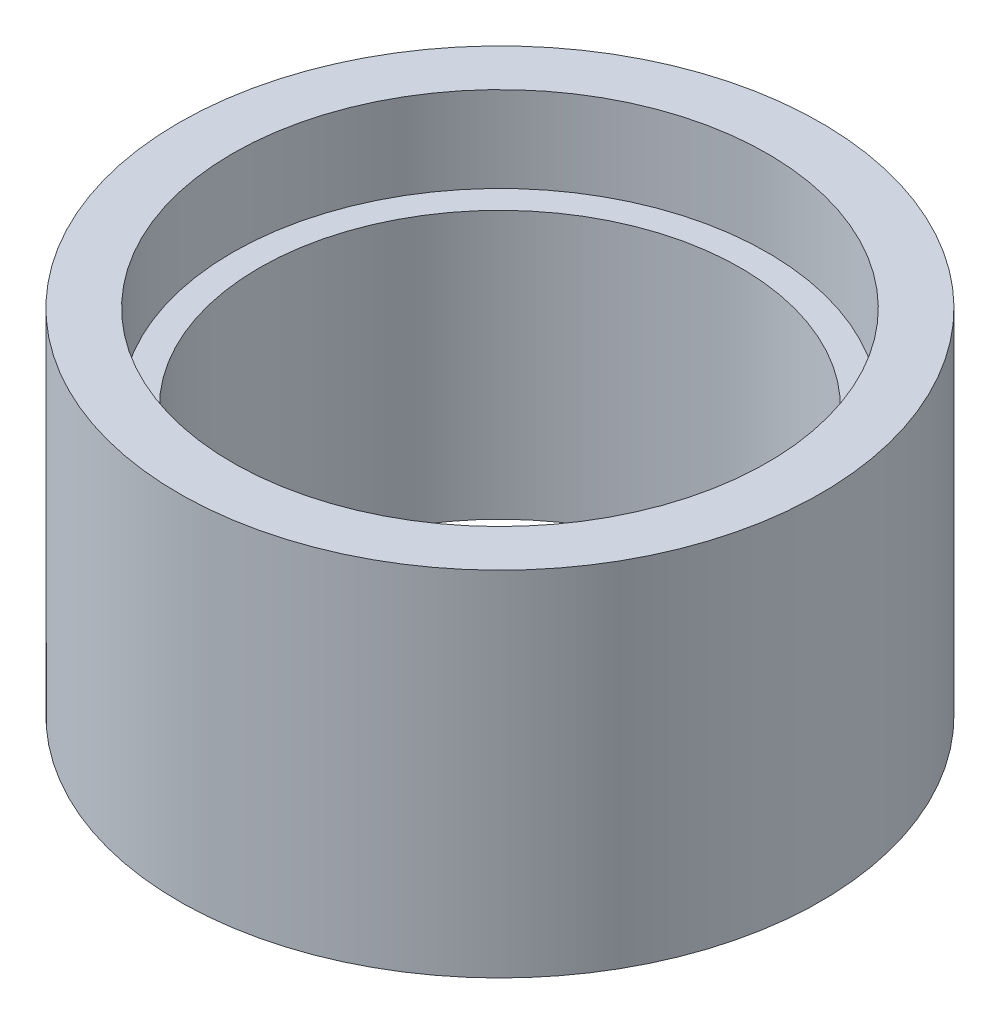
ISO-10303-21;
HEADER;
FILE_DESCRIPTION(('STEP AP214'),'2;1');
FILE_NAME('part.step','',(''),(''),'','','');
FILE_SCHEMA(('AUTOMOTIVE_DESIGN { 1 0 10303 214 1 1 1 1 }'));
ENDSEC;
DATA;
#1=APPLICATION_CONTEXT('core data for automotive mechanical design processes');
#2=APPLICATION_PROTOCOL_DEFINITION('international standard','automotive_design',2000,#1);
#3=PRODUCT_CONTEXT('',#1,'mechanical');
#4=PRODUCT('Part','Part','',(#3));
#5=PRODUCT_RELATED_PRODUCT_CATEGORY('part','',(#4));
#6=PRODUCT_DEFINITION_FORMATION('','',#4);
#7=PRODUCT_DEFINITION_CONTEXT('part definition',#1,'design');
#8=PRODUCT_DEFINITION('design','',#6,#7);
#9=PRODUCT_DEFINITION_SHAPE('','',#8);
#10=(LENGTH_UNIT() NAMED_UNIT(*) SI_UNIT(.MILLI.,.METRE.));
#11=(NAMED_UNIT(*) PLANE_ANGLE_UNIT() SI_UNIT($,.RADIAN.));
#12=(NAMED_UNIT(*) SI_UNIT($,.STERADIAN.) SOLID_ANGLE_UNIT());
#13=UNCERTAINTY_MEASURE_WITH_UNIT(LENGTH_MEASURE(1.E-05),#10,'distance_accuracy_value','');
#14=(GEOMETRIC_REPRESENTATION_CONTEXT(3) GLOBAL_UNCERTAINTY_ASSIGNED_CONTEXT((#13)) GLOBAL_UNIT_ASSIGNED_CONTEXT((#10,
#11,#12)) REPRESENTATION_CONTEXT('',''));
#15=CARTESIAN_POINT('',(0.,0.,0.));
#16=DIRECTION('',(0.,0.,1.));
#17=DIRECTION('',(1.,0.,0.));
#18=AXIS2_PLACEMENT_3D('',#15,#16,#17);
#19=CARTESIAN_POINT('',(0.,0.,0.));
#20=DIRECTION('',(0.,1.,0.));
#21=DIRECTION('',(-1.,0.,0.));
#22=AXIS2_PLACEMENT_3D('',#19,#20,#21);
#23=CYLINDRICAL_SURFACE('',#22,10.);
#24=CARTESIAN_POINT('',(0.,-3.2,0.));
#25=DIRECTION('',(0.,1.,0.));
#26=DIRECTION('',(-1.,0.,0.));
#27=AXIS2_PLACEMENT_3D('',#24,#25,#26);
#28=CIRCLE('',#27,10.);
#29=CARTESIAN_POINT('',(-10.,-3.2,0.));
#30=VERTEX_POINT('',#29);
#31=EDGE_CURVE('E10',#30,#30,#28,.T.);
#32=ORIENTED_EDGE('',*,*,#31,.F.);
#33=EDGE_LOOP('',(#32));
#34=FACE_BOUND('',#33,.T.);
#35=CARTESIAN_POINT('',(0.,0.,0.));
#36=DIRECTION('',(0.,1.,0.));
#37=DIRECTION('',(-1.,0.,0.));
#38=AXIS2_PLACEMENT_3D('',#35,#36,#37);
#39=CIRCLE('',#38,10.);
#40=CARTESIAN_POINT('',(-10.,0.,0.));
#41=VERTEX_POINT('',#40);
#42=EDGE_CURVE('E57',#41,#41,#39,.T.);
#43=ORIENTED_EDGE('',*,*,#42,.T.);
#44=EDGE_LOOP('',(#43));
#45=FACE_BOUND('',#44,.T.);
#46=ADVANCED_FACE('F35',(#34,#45),#23,.F.);
#47=CARTESIAN_POINT('',(0.,-3.2,0.));
#48=DIRECTION('',(0.,-1.,0.));
#49=DIRECTION('',(1.,0.,0.));
#50=AXIS2_PLACEMENT_3D('',#47,#48,#49);
#51=PLANE('',#50);
#52=CARTESIAN_POINT('',(0.,-3.2,0.));
#53=DIRECTION('',(0.,1.,0.));
#54=DIRECTION('',(-1.,0.,0.));
#55=AXIS2_PLACEMENT_3D('',#52,#53,#54);
#56=CIRCLE('',#55,9.);
#57=CARTESIAN_POINT('',(-9.,-3.2,0.));
#58=VERTEX_POINT('',#57);
#59=EDGE_CURVE('E41',#58,#58,#56,.T.);
#60=ORIENTED_EDGE('',*,*,#59,.F.);
#61=EDGE_LOOP('',(#60));
#62=FACE_BOUND('',#61,.T.);
#63=ORIENTED_EDGE('',*,*,#31,.T.);
#64=EDGE_LOOP('',(#63));
#65=FACE_BOUND('',#64,.T.);
#66=ADVANCED_FACE('F74',(#62,#65),#51,.F.);
#67=CARTESIAN_POINT('',(0.,0.,0.));
#68=DIRECTION('',(0.,1.,0.));
#69=DIRECTION('',(-1.,0.,0.));
#70=AXIS2_PLACEMENT_3D('',#67,#68,#69);
#71=CYLINDRICAL_SURFACE('',#70,9.);
#72=ORIENTED_EDGE('',*,*,#59,.T.);
#73=EDGE_LOOP('',(#72));
#74=FACE_BOUND('',#73,.T.);
#75=CARTESIAN_POINT('',(0.,-13.2,0.));
#76=DIRECTION('',(0.,1.,0.));
#77=DIRECTION('',(-1.,0.,0.));
#78=AXIS2_PLACEMENT_3D('',#75,#76,#77);
#79=CIRCLE('',#78,9.);
#80=CARTESIAN_POINT('',(-9.,-13.2,0.));
#81=VERTEX_POINT('',#80);
#82=EDGE_CURVE('E45',#81,#81,#79,.T.);
#83=ORIENTED_EDGE('',*,*,#82,.F.);
#84=EDGE_LOOP('',(#83));
#85=FACE_BOUND('',#84,.T.);
#86=ADVANCED_FACE('F79',(#74,#85),#71,.F.);
#87=CARTESIAN_POINT('',(0.,-13.2,0.));
#88=DIRECTION('',(0.,1.,0.));
#89=DIRECTION('',(-1.,0.,0.));
#90=AXIS2_PLACEMENT_3D('',#87,#88,#89);
#91=PLANE('',#90);
#92=CARTESIAN_POINT('',(0.,-13.2,0.));
#93=DIRECTION('',(0.,1.,0.));
#94=DIRECTION('',(-1.,0.,0.));
#95=AXIS2_PLACEMENT_3D('',#92,#93,#94);
#96=CIRCLE('',#95,12.);
#97=CARTESIAN_POINT('',(-12.,-13.2,0.));
#98=VERTEX_POINT('',#97);
#99=EDGE_CURVE('E49',#98,#98,#96,.T.);
#100=ORIENTED_EDGE('',*,*,#99,.F.);
#101=EDGE_LOOP('',(#100));
#102=FACE_BOUND('',#101,.T.);
#103=ORIENTED_EDGE('',*,*,#82,.T.);
#104=EDGE_LOOP('',(#103));
#105=FACE_BOUND('',#104,.T.);
#106=ADVANCED_FACE('F70',(#102,#105),#91,.F.);
#107=CARTESIAN_POINT('',(0.,0.,0.));
#108=DIRECTION('',(0.,1.,0.));
#109=DIRECTION('',(-1.,0.,0.));
#110=AXIS2_PLACEMENT_3D('',#107,#108,#109);
#111=CYLINDRICAL_SURFACE('',#110,12.);
#112=ORIENTED_EDGE('',*,*,#99,.T.);
#113=EDGE_LOOP('',(#112));
#114=FACE_BOUND('',#113,.T.);
#115=CARTESIAN_POINT('',(0.,0.,0.));
#116=DIRECTION('',(0.,1.,0.));
#117=DIRECTION('',(-1.,0.,0.));
#118=AXIS2_PLACEMENT_3D('',#115,#116,#117);
#119=CIRCLE('',#118,12.);
#120=CARTESIAN_POINT('',(-12.,0.,0.));
#121=VERTEX_POINT('',#120);
#122=EDGE_CURVE('E54',#121,#121,#119,.T.);
#123=ORIENTED_EDGE('',*,*,#122,.F.);
#124=EDGE_LOOP('',(#123));
#125=FACE_BOUND('',#124,.T.);
#126=ADVANCED_FACE('F64',(#114,#125),#111,.T.);
#127=CARTESIAN_POINT('',(0.,0.,0.));
#128=DIRECTION('',(0.,1.,0.));
#129=DIRECTION('',(-1.,0.,0.));
#130=AXIS2_PLACEMENT_3D('',#127,#128,#129);
#131=PLANE('',#130);
#132=ORIENTED_EDGE('',*,*,#122,.T.);
#133=EDGE_LOOP('',(#132));
#134=FACE_BOUND('',#133,.T.);
#135=ORIENTED_EDGE('',*,*,#42,.F.);
#136=EDGE_LOOP('',(#135));
#137=FACE_BOUND('',#136,.T.);
#138=ADVANCED_FACE('F62',(#134,#137),#131,.T.);
#139=CLOSED_SHELL('',(#46,#66,#86,#106,#126,#138));
#140=MANIFOLD_SOLID_BREP('B2',#139);
#141=ADVANCED_BREP_SHAPE_REPRESENTATION('',(#18,#140),#14);
#142=SHAPE_DEFINITION_REPRESENTATION(#9,#141);
ENDSEC;
END-ISO-10303-21;
